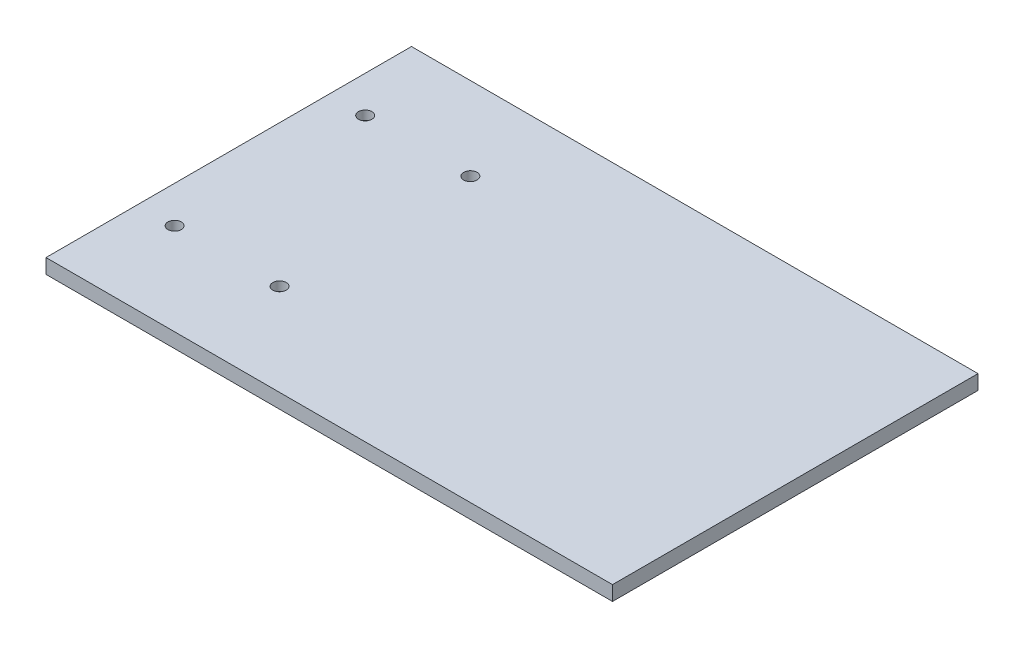
ISO-10303-21;
HEADER;
FILE_DESCRIPTION(('STEP AP214'),'2;1');
FILE_NAME('part.step','',(''),(''),'','','');
FILE_SCHEMA(('AUTOMOTIVE_DESIGN { 1 0 10303 214 1 1 1 1 }'));
ENDSEC;
DATA;
#1=APPLICATION_CONTEXT('core data for automotive mechanical design processes');
#2=APPLICATION_PROTOCOL_DEFINITION('international standard','automotive_design',2000,#1);
#3=PRODUCT_CONTEXT('',#1,'mechanical');
#4=PRODUCT('Part','Part','',(#3));
#5=PRODUCT_RELATED_PRODUCT_CATEGORY('part','',(#4));
#6=PRODUCT_DEFINITION_FORMATION('','',#4);
#7=PRODUCT_DEFINITION_CONTEXT('part definition',#1,'design');
#8=PRODUCT_DEFINITION('design','',#6,#7);
#9=PRODUCT_DEFINITION_SHAPE('','',#8);
#10=(LENGTH_UNIT() NAMED_UNIT(*) SI_UNIT(.MILLI.,.METRE.));
#11=(NAMED_UNIT(*) PLANE_ANGLE_UNIT() SI_UNIT($,.RADIAN.));
#12=(NAMED_UNIT(*) SI_UNIT($,.STERADIAN.) SOLID_ANGLE_UNIT());
#13=UNCERTAINTY_MEASURE_WITH_UNIT(LENGTH_MEASURE(1.E-05),#10,'distance_accuracy_value','');
#14=(GEOMETRIC_REPRESENTATION_CONTEXT(3) GLOBAL_UNCERTAINTY_ASSIGNED_CONTEXT((#13)) GLOBAL_UNIT_ASSIGNED_CONTEXT((#10,
#11,#12)) REPRESENTATION_CONTEXT('',''));
#15=CARTESIAN_POINT('',(0.,0.,0.));
#16=DIRECTION('',(0.,0.,1.));
#17=DIRECTION('',(1.,0.,0.));
#18=AXIS2_PLACEMENT_3D('',#15,#16,#17);
#19=CARTESIAN_POINT('',(-232.5,12.,-150.));
#20=DIRECTION('',(1.,0.,0.));
#21=DIRECTION('',(0.,0.,-1.));
#22=AXIS2_PLACEMENT_3D('',#19,#20,#21);
#23=PLANE('',#22);
#24=DIRECTION('',(0.,0.,1.));
#25=VECTOR('',#24,1.);
#26=CARTESIAN_POINT('',(-232.5,0.,-150.));
#27=LINE('',#26,#25);
#28=CARTESIAN_POINT('',(-232.5,0.,-150.));
#29=VERTEX_POINT('',#28);
#30=CARTESIAN_POINT('',(-232.5,0.,150.));
#31=VERTEX_POINT('',#30);
#32=EDGE_CURVE('E99',#29,#31,#27,.T.);
#33=ORIENTED_EDGE('',*,*,#32,.T.);
#34=DIRECTION('',(0.,-1.,0.));
#35=VECTOR('',#34,1.);
#36=CARTESIAN_POINT('',(-232.5,12.,150.));
#37=LINE('',#36,#35);
#38=CARTESIAN_POINT('',(-232.5,12.,150.));
#39=VERTEX_POINT('',#38);
#40=EDGE_CURVE('E11',#39,#31,#37,.T.);
#41=ORIENTED_EDGE('',*,*,#40,.F.);
#42=DIRECTION('',(0.,0.,1.));
#43=VECTOR('',#42,1.);
#44=CARTESIAN_POINT('',(-232.5,12.,-150.));
#45=LINE('',#44,#43);
#46=CARTESIAN_POINT('',(-232.5,12.,-150.));
#47=VERTEX_POINT('',#46);
#48=EDGE_CURVE('E86',#47,#39,#45,.T.);
#49=ORIENTED_EDGE('',*,*,#48,.F.);
#50=DIRECTION('',(0.,-1.,0.));
#51=VECTOR('',#50,1.);
#52=CARTESIAN_POINT('',(-232.5,12.,-150.));
#53=LINE('',#52,#51);
#54=EDGE_CURVE('E95',#47,#29,#53,.T.);
#55=ORIENTED_EDGE('',*,*,#54,.T.);
#56=EDGE_LOOP('',(#33,#41,#49,#55));
#57=FACE_BOUND('',#56,.T.);
#58=ADVANCED_FACE('F33',(#57),#23,.F.);
#59=CARTESIAN_POINT('',(-232.5,12.,150.));
#60=DIRECTION('',(0.,0.,-1.));
#61=DIRECTION('',(-1.,0.,0.));
#62=AXIS2_PLACEMENT_3D('',#59,#60,#61);
#63=PLANE('',#62);
#64=DIRECTION('',(1.,0.,0.));
#65=VECTOR('',#64,1.);
#66=CARTESIAN_POINT('',(-232.5,0.,150.));
#67=LINE('',#66,#65);
#68=CARTESIAN_POINT('',(232.5,0.,150.));
#69=VERTEX_POINT('',#68);
#70=EDGE_CURVE('E90',#31,#69,#67,.T.);
#71=ORIENTED_EDGE('',*,*,#70,.T.);
#72=DIRECTION('',(0.,-1.,0.));
#73=VECTOR('',#72,1.);
#74=CARTESIAN_POINT('',(232.5,12.,150.));
#75=LINE('',#74,#73);
#76=CARTESIAN_POINT('',(232.5,12.,150.));
#77=VERTEX_POINT('',#76);
#78=EDGE_CURVE('E42',#77,#69,#75,.T.);
#79=ORIENTED_EDGE('',*,*,#78,.F.);
#80=DIRECTION('',(1.,0.,0.));
#81=VECTOR('',#80,1.);
#82=CARTESIAN_POINT('',(-232.5,12.,150.));
#83=LINE('',#82,#81);
#84=EDGE_CURVE('E81',#39,#77,#83,.T.);
#85=ORIENTED_EDGE('',*,*,#84,.F.);
#86=ORIENTED_EDGE('',*,*,#40,.T.);
#87=EDGE_LOOP('',(#71,#79,#85,#86));
#88=FACE_BOUND('',#87,.T.);
#89=ADVANCED_FACE('F89',(#88),#63,.F.);
#90=CARTESIAN_POINT('',(232.5,12.,-150.));
#91=DIRECTION('',(-1.,0.,0.));
#92=DIRECTION('',(0.,0.,1.));
#93=AXIS2_PLACEMENT_3D('',#90,#91,#92);
#94=PLANE('',#93);
#95=DIRECTION('',(0.,0.,-1.));
#96=VECTOR('',#95,1.);
#97=CARTESIAN_POINT('',(232.5,0.,-150.));
#98=LINE('',#97,#96);
#99=CARTESIAN_POINT('',(232.5,0.,-150.));
#100=VERTEX_POINT('',#99);
#101=EDGE_CURVE('E68',#69,#100,#98,.T.);
#102=ORIENTED_EDGE('',*,*,#101,.T.);
#103=DIRECTION('',(0.,-1.,0.));
#104=VECTOR('',#103,1.);
#105=CARTESIAN_POINT('',(232.5,12.,-150.));
#106=LINE('',#105,#104);
#107=CARTESIAN_POINT('',(232.5,12.,-150.));
#108=VERTEX_POINT('',#107);
#109=EDGE_CURVE('E91',#108,#100,#106,.T.);
#110=ORIENTED_EDGE('',*,*,#109,.F.);
#111=DIRECTION('',(0.,0.,-1.));
#112=VECTOR('',#111,1.);
#113=CARTESIAN_POINT('',(232.5,12.,-150.));
#114=LINE('',#113,#112);
#115=EDGE_CURVE('E84',#77,#108,#114,.T.);
#116=ORIENTED_EDGE('',*,*,#115,.F.);
#117=ORIENTED_EDGE('',*,*,#78,.T.);
#118=EDGE_LOOP('',(#102,#110,#116,#117));
#119=FACE_BOUND('',#118,.T.);
#120=ADVANCED_FACE('F93',(#119),#94,.F.);
#121=CARTESIAN_POINT('',(-232.5,12.,-150.));
#122=DIRECTION('',(0.,0.,1.));
#123=DIRECTION('',(1.,0.,0.));
#124=AXIS2_PLACEMENT_3D('',#121,#122,#123);
#125=PLANE('',#124);
#126=DIRECTION('',(-1.,0.,0.));
#127=VECTOR('',#126,1.);
#128=CARTESIAN_POINT('',(-232.5,0.,-150.));
#129=LINE('',#128,#127);
#130=EDGE_CURVE('E74',#100,#29,#129,.T.);
#131=ORIENTED_EDGE('',*,*,#130,.T.);
#132=ORIENTED_EDGE('',*,*,#54,.F.);
#133=DIRECTION('',(-1.,0.,0.));
#134=VECTOR('',#133,1.);
#135=CARTESIAN_POINT('',(-232.5,12.,-150.));
#136=LINE('',#135,#134);
#137=EDGE_CURVE('E51',#108,#47,#136,.T.);
#138=ORIENTED_EDGE('',*,*,#137,.F.);
#139=ORIENTED_EDGE('',*,*,#109,.T.);
#140=EDGE_LOOP('',(#131,#132,#138,#139));
#141=FACE_BOUND('',#140,.T.);
#142=ADVANCED_FACE('F155',(#141),#125,.F.);
#143=CARTESIAN_POINT('',(0.,12.,0.));
#144=DIRECTION('',(0.,1.,0.));
#145=DIRECTION('',(0.,0.,1.));
#146=AXIS2_PLACEMENT_3D('',#143,#144,#145);
#147=PLANE('',#146);
#148=CARTESIAN_POINT('',(-116.169058484688,12.,74.6127190092878));
#149=DIRECTION('',(0.,1.,0.));
#150=DIRECTION('',(0.,0.,1.));
#151=AXIS2_PLACEMENT_3D('',#148,#149,#150);
#152=CIRCLE('',#151,5.49999999999999);
#153=CARTESIAN_POINT('',(-116.169058484688,12.,80.1127190092878));
#154=VERTEX_POINT('',#153);
#155=EDGE_CURVE('E36',#154,#154,#152,.T.);
#156=ORIENTED_EDGE('',*,*,#155,.F.);
#157=EDGE_LOOP('',(#156));
#158=FACE_BOUND('',#157,.T.);
#159=CARTESIAN_POINT('',(-202.304435361539,12.,74.6127190092878));
#160=DIRECTION('',(0.,1.,0.));
#161=DIRECTION('',(0.,0.,1.));
#162=AXIS2_PLACEMENT_3D('',#159,#160,#161);
#163=CIRCLE('',#162,5.49999999999999);
#164=CARTESIAN_POINT('',(-202.304435361539,12.,80.1127190092878));
#165=VERTEX_POINT('',#164);
#166=EDGE_CURVE('E115',#165,#165,#163,.T.);
#167=ORIENTED_EDGE('',*,*,#166,.F.);
#168=EDGE_LOOP('',(#167));
#169=FACE_BOUND('',#168,.T.);
#170=CARTESIAN_POINT('',(-202.5,12.,-82.));
#171=DIRECTION('',(0.,1.,0.));
#172=DIRECTION('',(0.,0.,1.));
#173=AXIS2_PLACEMENT_3D('',#170,#171,#172);
#174=CIRCLE('',#173,5.49999999999999);
#175=CARTESIAN_POINT('',(-202.5,12.,-76.5));
#176=VERTEX_POINT('',#175);
#177=EDGE_CURVE('E111',#176,#176,#174,.T.);
#178=ORIENTED_EDGE('',*,*,#177,.F.);
#179=EDGE_LOOP('',(#178));
#180=FACE_BOUND('',#179,.T.);
#181=CARTESIAN_POINT('',(-116.169058484688,12.,-82.));
#182=DIRECTION('',(0.,1.,0.));
#183=DIRECTION('',(0.,0.,1.));
#184=AXIS2_PLACEMENT_3D('',#181,#182,#183);
#185=CIRCLE('',#184,5.49999999999999);
#186=CARTESIAN_POINT('',(-116.169058484688,12.,-76.5));
#187=VERTEX_POINT('',#186);
#188=EDGE_CURVE('E102',#187,#187,#185,.T.);
#189=ORIENTED_EDGE('',*,*,#188,.F.);
#190=EDGE_LOOP('',(#189));
#191=FACE_BOUND('',#190,.T.);
#192=ORIENTED_EDGE('',*,*,#48,.T.);
#193=ORIENTED_EDGE('',*,*,#84,.T.);
#194=ORIENTED_EDGE('',*,*,#115,.T.);
#195=ORIENTED_EDGE('',*,*,#137,.T.);
#196=EDGE_LOOP('',(#192,#193,#194,#195));
#197=FACE_BOUND('',#196,.T.);
#198=ADVANCED_FACE('F82',(#158,#169,#180,#191,#197),#147,.T.);
#199=CARTESIAN_POINT('',(0.,0.,0.));
#200=DIRECTION('',(0.,1.,0.));
#201=DIRECTION('',(0.,0.,1.));
#202=AXIS2_PLACEMENT_3D('',#199,#200,#201);
#203=PLANE('',#202);
#204=CARTESIAN_POINT('',(-116.169058484688,0.,74.6127190092878));
#205=DIRECTION('',(0.,-1.,0.));
#206=DIRECTION('',(0.,0.,-1.));
#207=AXIS2_PLACEMENT_3D('',#204,#205,#206);
#208=CIRCLE('',#207,9.99999999999999);
#209=CARTESIAN_POINT('',(-116.169058484688,0.,64.6127190092878));
#210=VERTEX_POINT('',#209);
#211=EDGE_CURVE('E274',#210,#210,#208,.T.);
#212=ORIENTED_EDGE('',*,*,#211,.F.);
#213=EDGE_LOOP('',(#212));
#214=FACE_BOUND('',#213,.T.);
#215=CARTESIAN_POINT('',(-202.304435361539,0.,74.6127190092878));
#216=DIRECTION('',(0.,-1.,0.));
#217=DIRECTION('',(0.,0.,-1.));
#218=AXIS2_PLACEMENT_3D('',#215,#216,#217);
#219=CIRCLE('',#218,10.);
#220=CARTESIAN_POINT('',(-202.304435361539,0.,64.6127190092878));
#221=VERTEX_POINT('',#220);
#222=EDGE_CURVE('E124',#221,#221,#219,.T.);
#223=ORIENTED_EDGE('',*,*,#222,.F.);
#224=EDGE_LOOP('',(#223));
#225=FACE_BOUND('',#224,.T.);
#226=CARTESIAN_POINT('',(-202.5,0.,-82.));
#227=DIRECTION('',(0.,-1.,0.));
#228=DIRECTION('',(0.,0.,-1.));
#229=AXIS2_PLACEMENT_3D('',#226,#227,#228);
#230=CIRCLE('',#229,10.);
#231=CARTESIAN_POINT('',(-202.5,0.,-92.));
#232=VERTEX_POINT('',#231);
#233=EDGE_CURVE('E117',#232,#232,#230,.T.);
#234=ORIENTED_EDGE('',*,*,#233,.F.);
#235=EDGE_LOOP('',(#234));
#236=FACE_BOUND('',#235,.T.);
#237=CARTESIAN_POINT('',(-116.169058484688,0.,-82.));
#238=DIRECTION('',(0.,-1.,0.));
#239=DIRECTION('',(0.,0.,-1.));
#240=AXIS2_PLACEMENT_3D('',#237,#238,#239);
#241=CIRCLE('',#240,9.99999999999999);
#242=CARTESIAN_POINT('',(-116.169058484688,0.,-92.));
#243=VERTEX_POINT('',#242);
#244=EDGE_CURVE('E113',#243,#243,#241,.T.);
#245=ORIENTED_EDGE('',*,*,#244,.F.);
#246=EDGE_LOOP('',(#245));
#247=FACE_BOUND('',#246,.T.);
#248=ORIENTED_EDGE('',*,*,#32,.F.);
#249=ORIENTED_EDGE('',*,*,#130,.F.);
#250=ORIENTED_EDGE('',*,*,#101,.F.);
#251=ORIENTED_EDGE('',*,*,#70,.F.);
#252=EDGE_LOOP('',(#248,#249,#250,#251));
#253=FACE_BOUND('',#252,.T.);
#254=ADVANCED_FACE('F148',(#214,#225,#236,#247,#253),#203,.F.);
#255=CARTESIAN_POINT('',(-116.169058484688,0.,-82.));
#256=DIRECTION('',(0.,-1.,0.));
#257=DIRECTION('',(0.,0.,-1.));
#258=AXIS2_PLACEMENT_3D('',#255,#256,#257);
#259=CYLINDRICAL_SURFACE('',#258,5.49999999999999);
#260=ORIENTED_EDGE('',*,*,#188,.T.);
#261=EDGE_LOOP('',(#260));
#262=FACE_BOUND('',#261,.T.);
#263=CARTESIAN_POINT('',(-116.169058484688,4.5,-82.));
#264=DIRECTION('',(0.,-1.,0.));
#265=DIRECTION('',(0.,0.,-1.));
#266=AXIS2_PLACEMENT_3D('',#263,#264,#265);
#267=CIRCLE('',#266,5.49999999999999);
#268=CARTESIAN_POINT('',(-116.169058484688,4.5,-87.5));
#269=VERTEX_POINT('',#268);
#270=EDGE_CURVE('E110',#269,#269,#267,.T.);
#271=ORIENTED_EDGE('',*,*,#270,.T.);
#272=EDGE_LOOP('',(#271));
#273=FACE_BOUND('',#272,.T.);
#274=ADVANCED_FACE('F139',(#262,#273),#259,.F.);
#275=CARTESIAN_POINT('',(-116.169058484688,0.,-82.));
#276=DIRECTION('',(0.,-1.,0.));
#277=DIRECTION('',(0.,0.,-1.));
#278=AXIS2_PLACEMENT_3D('',#275,#276,#277);
#279=CONICAL_SURFACE('',#278,9.99999999999999,0.785398163397448);
#280=ORIENTED_EDGE('',*,*,#270,.F.);
#281=EDGE_LOOP('',(#280));
#282=FACE_BOUND('',#281,.T.);
#283=ORIENTED_EDGE('',*,*,#244,.T.);
#284=EDGE_LOOP('',(#283));
#285=FACE_BOUND('',#284,.T.);
#286=ADVANCED_FACE('F141',(#282,#285),#279,.F.);
#287=CARTESIAN_POINT('',(-202.5,0.,-82.));
#288=DIRECTION('',(0.,-1.,0.));
#289=DIRECTION('',(0.,0.,-1.));
#290=AXIS2_PLACEMENT_3D('',#287,#288,#289);
#291=CYLINDRICAL_SURFACE('',#290,5.49999999999999);
#292=ORIENTED_EDGE('',*,*,#177,.T.);
#293=EDGE_LOOP('',(#292));
#294=FACE_BOUND('',#293,.T.);
#295=CARTESIAN_POINT('',(-202.5,4.5,-82.));
#296=DIRECTION('',(0.,-1.,0.));
#297=DIRECTION('',(0.,0.,-1.));
#298=AXIS2_PLACEMENT_3D('',#295,#296,#297);
#299=CIRCLE('',#298,5.50000000000001);
#300=CARTESIAN_POINT('',(-202.5,4.5,-87.5));
#301=VERTEX_POINT('',#300);
#302=EDGE_CURVE('E114',#301,#301,#299,.T.);
#303=ORIENTED_EDGE('',*,*,#302,.T.);
#304=EDGE_LOOP('',(#303));
#305=FACE_BOUND('',#304,.T.);
#306=ADVANCED_FACE('F144',(#294,#305),#291,.F.);
#307=CARTESIAN_POINT('',(-202.5,0.,-82.));
#308=DIRECTION('',(0.,-1.,0.));
#309=DIRECTION('',(0.,0.,-1.));
#310=AXIS2_PLACEMENT_3D('',#307,#308,#309);
#311=CONICAL_SURFACE('',#310,10.,0.785398163397448);
#312=ORIENTED_EDGE('',*,*,#302,.F.);
#313=EDGE_LOOP('',(#312));
#314=FACE_BOUND('',#313,.T.);
#315=ORIENTED_EDGE('',*,*,#233,.T.);
#316=EDGE_LOOP('',(#315));
#317=FACE_BOUND('',#316,.T.);
#318=ADVANCED_FACE('F215',(#314,#317),#311,.F.);
#319=CARTESIAN_POINT('',(-202.304435361539,0.,74.6127190092878));
#320=DIRECTION('',(0.,-1.,0.));
#321=DIRECTION('',(0.,0.,-1.));
#322=AXIS2_PLACEMENT_3D('',#319,#320,#321);
#323=CYLINDRICAL_SURFACE('',#322,5.49999999999999);
#324=ORIENTED_EDGE('',*,*,#166,.T.);
#325=EDGE_LOOP('',(#324));
#326=FACE_BOUND('',#325,.T.);
#327=CARTESIAN_POINT('',(-202.304435361539,4.5,74.6127190092878));
#328=DIRECTION('',(0.,-1.,0.));
#329=DIRECTION('',(0.,0.,-1.));
#330=AXIS2_PLACEMENT_3D('',#327,#328,#329);
#331=CIRCLE('',#330,5.50000000000001);
#332=CARTESIAN_POINT('',(-202.304435361539,4.5,69.1127190092878));
#333=VERTEX_POINT('',#332);
#334=EDGE_CURVE('E118',#333,#333,#331,.T.);
#335=ORIENTED_EDGE('',*,*,#334,.T.);
#336=EDGE_LOOP('',(#335));
#337=FACE_BOUND('',#336,.T.);
#338=ADVANCED_FACE('F225',(#326,#337),#323,.F.);
#339=CARTESIAN_POINT('',(-202.304435361539,0.,74.6127190092878));
#340=DIRECTION('',(0.,-1.,0.));
#341=DIRECTION('',(0.,0.,-1.));
#342=AXIS2_PLACEMENT_3D('',#339,#340,#341);
#343=CONICAL_SURFACE('',#342,10.,0.785398163397448);
#344=ORIENTED_EDGE('',*,*,#334,.F.);
#345=EDGE_LOOP('',(#344));
#346=FACE_BOUND('',#345,.T.);
#347=ORIENTED_EDGE('',*,*,#222,.T.);
#348=EDGE_LOOP('',(#347));
#349=FACE_BOUND('',#348,.T.);
#350=ADVANCED_FACE('F235',(#346,#349),#343,.F.);
#351=CARTESIAN_POINT('',(-116.169058484688,0.,74.6127190092878));
#352=DIRECTION('',(0.,-1.,0.));
#353=DIRECTION('',(0.,0.,-1.));
#354=AXIS2_PLACEMENT_3D('',#351,#352,#353);
#355=CYLINDRICAL_SURFACE('',#354,5.49999999999999);
#356=ORIENTED_EDGE('',*,*,#155,.T.);
#357=EDGE_LOOP('',(#356));
#358=FACE_BOUND('',#357,.T.);
#359=CARTESIAN_POINT('',(-116.169058484688,4.5,74.6127190092878));
#360=DIRECTION('',(0.,-1.,0.));
#361=DIRECTION('',(0.,0.,-1.));
#362=AXIS2_PLACEMENT_3D('',#359,#360,#361);
#363=CIRCLE('',#362,5.49999999999999);
#364=CARTESIAN_POINT('',(-116.169058484688,4.5,69.1127190092878));
#365=VERTEX_POINT('',#364);
#366=EDGE_CURVE('E271',#365,#365,#363,.T.);
#367=ORIENTED_EDGE('',*,*,#366,.T.);
#368=EDGE_LOOP('',(#367));
#369=FACE_BOUND('',#368,.T.);
#370=ADVANCED_FACE('F244',(#358,#369),#355,.F.);
#371=CARTESIAN_POINT('',(-116.169058484688,0.,74.6127190092878));
#372=DIRECTION('',(0.,-1.,0.));
#373=DIRECTION('',(0.,0.,-1.));
#374=AXIS2_PLACEMENT_3D('',#371,#372,#373);
#375=CONICAL_SURFACE('',#374,9.99999999999999,0.785398163397448);
#376=ORIENTED_EDGE('',*,*,#366,.F.);
#377=EDGE_LOOP('',(#376));
#378=FACE_BOUND('',#377,.T.);
#379=ORIENTED_EDGE('',*,*,#211,.T.);
#380=EDGE_LOOP('',(#379));
#381=FACE_BOUND('',#380,.T.);
#382=ADVANCED_FACE('F254',(#378,#381),#375,.F.);
#383=CLOSED_SHELL('',(#58,#89,#120,#142,#198,#254,#274,#286,#306,#318,#338,#350,#370,#382));
#384=MANIFOLD_SOLID_BREP('B2',#383);
#385=ADVANCED_BREP_SHAPE_REPRESENTATION('',(#18,#384),#14);
#386=SHAPE_DEFINITION_REPRESENTATION(#9,#385);
ENDSEC;
END-ISO-10303-21;
